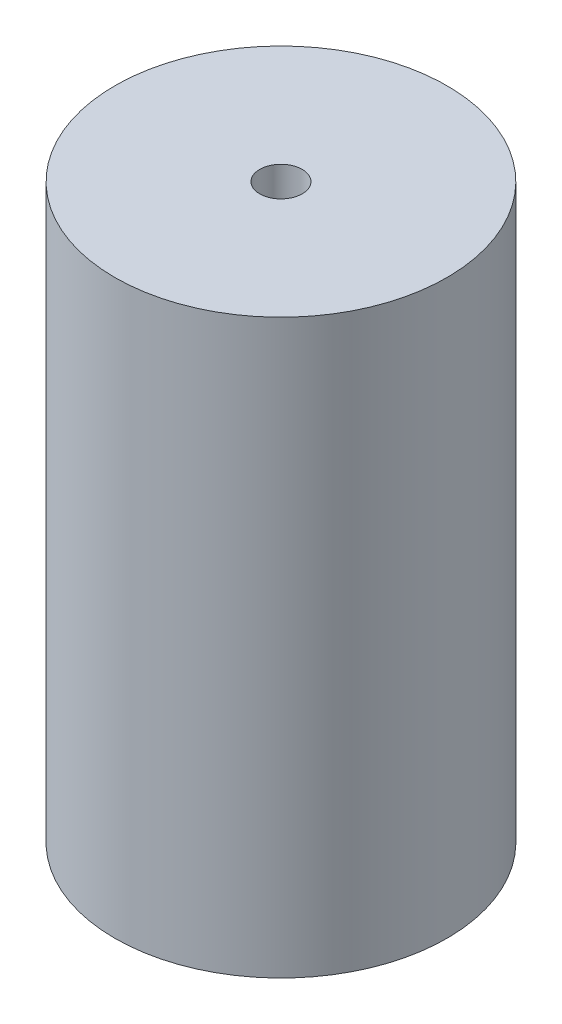
ISO-10303-21;
HEADER;
FILE_DESCRIPTION(('STEP AP214'),'2;1');
FILE_NAME('part.step','',(''),(''),'','','');
FILE_SCHEMA(('AUTOMOTIVE_DESIGN { 1 0 10303 214 1 1 1 1 }'));
ENDSEC;
DATA;
#1=APPLICATION_CONTEXT('core data for automotive mechanical design processes');
#2=APPLICATION_PROTOCOL_DEFINITION('international standard','automotive_design',2000,#1);
#3=PRODUCT_CONTEXT('',#1,'mechanical');
#4=PRODUCT('Part','Part','',(#3));
#5=PRODUCT_RELATED_PRODUCT_CATEGORY('part','',(#4));
#6=PRODUCT_DEFINITION_FORMATION('','',#4);
#7=PRODUCT_DEFINITION_CONTEXT('part definition',#1,'design');
#8=PRODUCT_DEFINITION('design','',#6,#7);
#9=PRODUCT_DEFINITION_SHAPE('','',#8);
#10=(LENGTH_UNIT() NAMED_UNIT(*) SI_UNIT(.MILLI.,.METRE.));
#11=(NAMED_UNIT(*) PLANE_ANGLE_UNIT() SI_UNIT($,.RADIAN.));
#12=(NAMED_UNIT(*) SI_UNIT($,.STERADIAN.) SOLID_ANGLE_UNIT());
#13=UNCERTAINTY_MEASURE_WITH_UNIT(LENGTH_MEASURE(1.E-05),#10,'distance_accuracy_value','');
#14=(GEOMETRIC_REPRESENTATION_CONTEXT(3) GLOBAL_UNCERTAINTY_ASSIGNED_CONTEXT((#13)) GLOBAL_UNIT_ASSIGNED_CONTEXT((#10,
#11,#12)) REPRESENTATION_CONTEXT('',''));
#15=CARTESIAN_POINT('',(0.,0.,0.));
#16=DIRECTION('',(0.,0.,1.));
#17=DIRECTION('',(1.,0.,0.));
#18=AXIS2_PLACEMENT_3D('',#15,#16,#17);
#19=CARTESIAN_POINT('',(0.,12.7,0.));
#20=DIRECTION('',(0.,1.,0.));
#21=DIRECTION('',(0.,0.,1.));
#22=AXIS2_PLACEMENT_3D('',#19,#20,#21);
#23=PLANE('',#22);
#24=CARTESIAN_POINT('',(0.,12.7,0.));
#25=DIRECTION('',(0.,1.,0.));
#26=DIRECTION('',(0.,0.,1.));
#27=AXIS2_PLACEMENT_3D('',#24,#25,#26);
#28=CIRCLE('',#27,8.9296875);
#29=CARTESIAN_POINT('',(0.,12.7,8.9296875));
#30=VERTEX_POINT('',#29);
#31=EDGE_CURVE('E70',#30,#30,#28,.T.);
#32=ORIENTED_EDGE('',*,*,#31,.F.);
#33=EDGE_LOOP('',(#32));
#34=FACE_BOUND('',#33,.T.);
#35=CARTESIAN_POINT('',(0.,12.7,0.));
#36=DIRECTION('',(0.,1.,0.));
#37=DIRECTION('',(0.,0.,1.));
#38=AXIS2_PLACEMENT_3D('',#35,#36,#37);
#39=CIRCLE('',#38,63.5);
#40=CARTESIAN_POINT('',(0.,12.7,63.5));
#41=VERTEX_POINT('',#40);
#42=EDGE_CURVE('E11',#41,#41,#39,.F.);
#43=ORIENTED_EDGE('',*,*,#42,.F.);
#44=EDGE_LOOP('',(#43));
#45=FACE_BOUND('',#44,.T.);
#46=ADVANCED_FACE('F41',(#34,#45),#23,.T.);
#47=CARTESIAN_POINT('',(0.,227.965,0.));
#48=DIRECTION('',(0.,-1.,0.));
#49=DIRECTION('',(0.,0.,-1.));
#50=AXIS2_PLACEMENT_3D('',#47,#48,#49);
#51=CYLINDRICAL_SURFACE('',#50,63.5);
#52=ORIENTED_EDGE('',*,*,#42,.T.);
#53=EDGE_LOOP('',(#52));
#54=FACE_BOUND('',#53,.T.);
#55=CARTESIAN_POINT('',(0.,227.965,0.));
#56=DIRECTION('',(0.,1.,0.));
#57=DIRECTION('',(0.,0.,1.));
#58=AXIS2_PLACEMENT_3D('',#55,#56,#57);
#59=CIRCLE('',#58,63.5);
#60=CARTESIAN_POINT('',(0.,227.965,63.5));
#61=VERTEX_POINT('',#60);
#62=EDGE_CURVE('E55',#61,#61,#59,.T.);
#63=ORIENTED_EDGE('',*,*,#62,.T.);
#64=EDGE_LOOP('',(#63));
#65=FACE_BOUND('',#64,.T.);
#66=ADVANCED_FACE('F92',(#54,#65),#51,.F.);
#67=CARTESIAN_POINT('',(0.,227.965,0.));
#68=DIRECTION('',(0.,1.,0.));
#69=DIRECTION('',(0.,0.,1.));
#70=AXIS2_PLACEMENT_3D('',#67,#68,#69);
#71=PLANE('',#70);
#72=CARTESIAN_POINT('',(0.,227.965,0.));
#73=DIRECTION('',(0.,1.,0.));
#74=DIRECTION('',(0.,0.,1.));
#75=AXIS2_PLACEMENT_3D('',#72,#73,#74);
#76=CIRCLE('',#75,8.9296875);
#77=CARTESIAN_POINT('',(0.,227.965,8.9296875));
#78=VERTEX_POINT('',#77);
#79=EDGE_CURVE('E45',#78,#78,#76,.T.);
#80=ORIENTED_EDGE('',*,*,#79,.T.);
#81=EDGE_LOOP('',(#80));
#82=FACE_BOUND('',#81,.T.);
#83=ORIENTED_EDGE('',*,*,#62,.F.);
#84=EDGE_LOOP('',(#83));
#85=FACE_BOUND('',#84,.T.);
#86=ADVANCED_FACE('F80',(#82,#85),#71,.F.);
#87=CARTESIAN_POINT('',(0.,-94.8690000000001,0.));
#88=DIRECTION('',(0.,1.,0.));
#89=DIRECTION('',(0.,0.,1.));
#90=AXIS2_PLACEMENT_3D('',#87,#88,#89);
#91=CYLINDRICAL_SURFACE('',#90,8.9296875);
#92=CARTESIAN_POINT('',(0.,240.665,0.));
#93=DIRECTION('',(0.,1.,0.));
#94=DIRECTION('',(0.,0.,1.));
#95=AXIS2_PLACEMENT_3D('',#92,#93,#94);
#96=CIRCLE('',#95,8.9296875);
#97=CARTESIAN_POINT('',(0.,240.665,8.9296875));
#98=VERTEX_POINT('',#97);
#99=EDGE_CURVE('E73',#98,#98,#96,.T.);
#100=ORIENTED_EDGE('',*,*,#99,.T.);
#101=EDGE_LOOP('',(#100));
#102=FACE_BOUND('',#101,.T.);
#103=ORIENTED_EDGE('',*,*,#79,.F.);
#104=EDGE_LOOP('',(#103));
#105=FACE_BOUND('',#104,.T.);
#106=ADVANCED_FACE('F83',(#102,#105),#91,.F.);
#107=ORIENTED_EDGE('',*,*,#31,.T.);
#108=EDGE_LOOP('',(#107));
#109=FACE_BOUND('',#108,.T.);
#110=CARTESIAN_POINT('',(0.,0.,0.));
#111=DIRECTION('',(0.,1.,0.));
#112=DIRECTION('',(0.,0.,1.));
#113=AXIS2_PLACEMENT_3D('',#110,#111,#112);
#114=CIRCLE('',#113,8.9296875);
#115=CARTESIAN_POINT('',(0.,0.,8.9296875));
#116=VERTEX_POINT('',#115);
#117=EDGE_CURVE('E66',#116,#116,#114,.T.);
#118=ORIENTED_EDGE('',*,*,#117,.F.);
#119=EDGE_LOOP('',(#118));
#120=FACE_BOUND('',#119,.T.);
#121=ADVANCED_FACE('F85',(#109,#120),#91,.F.);
#122=CARTESIAN_POINT('',(0.,12.7,0.));
#123=DIRECTION('',(0.,-1.,0.));
#124=DIRECTION('',(0.,0.,-1.));
#125=AXIS2_PLACEMENT_3D('',#122,#123,#124);
#126=CYLINDRICAL_SURFACE('',#125,69.85);
#127=CARTESIAN_POINT('',(0.,0.,0.));
#128=DIRECTION('',(0.,1.,0.));
#129=DIRECTION('',(0.,0.,1.));
#130=AXIS2_PLACEMENT_3D('',#127,#128,#129);
#131=CIRCLE('',#130,69.85);
#132=CARTESIAN_POINT('',(0.,0.,69.85));
#133=VERTEX_POINT('',#132);
#134=EDGE_CURVE('E49',#133,#133,#131,.T.);
#135=ORIENTED_EDGE('',*,*,#134,.T.);
#136=EDGE_LOOP('',(#135));
#137=FACE_BOUND('',#136,.T.);
#138=CARTESIAN_POINT('',(0.,240.665,0.));
#139=DIRECTION('',(0.,1.,0.));
#140=DIRECTION('',(0.,0.,1.));
#141=AXIS2_PLACEMENT_3D('',#138,#139,#140);
#142=CIRCLE('',#141,69.85);
#143=CARTESIAN_POINT('',(0.,240.665,69.85));
#144=VERTEX_POINT('',#143);
#145=EDGE_CURVE('E61',#144,#144,#142,.T.);
#146=ORIENTED_EDGE('',*,*,#145,.F.);
#147=EDGE_LOOP('',(#146));
#148=FACE_BOUND('',#147,.T.);
#149=ADVANCED_FACE('F43',(#137,#148),#126,.T.);
#150=CARTESIAN_POINT('',(0.,0.,0.));
#151=DIRECTION('',(0.,1.,0.));
#152=DIRECTION('',(0.,0.,1.));
#153=AXIS2_PLACEMENT_3D('',#150,#151,#152);
#154=PLANE('',#153);
#155=ORIENTED_EDGE('',*,*,#117,.T.);
#156=EDGE_LOOP('',(#155));
#157=FACE_BOUND('',#156,.T.);
#158=ORIENTED_EDGE('',*,*,#134,.F.);
#159=EDGE_LOOP('',(#158));
#160=FACE_BOUND('',#159,.T.);
#161=ADVANCED_FACE('F104',(#157,#160),#154,.F.);
#162=CARTESIAN_POINT('',(0.,240.665,0.));
#163=DIRECTION('',(0.,1.,0.));
#164=DIRECTION('',(0.,0.,1.));
#165=AXIS2_PLACEMENT_3D('',#162,#163,#164);
#166=PLANE('',#165);
#167=ORIENTED_EDGE('',*,*,#99,.F.);
#168=EDGE_LOOP('',(#167));
#169=FACE_BOUND('',#168,.T.);
#170=ORIENTED_EDGE('',*,*,#145,.T.);
#171=EDGE_LOOP('',(#170));
#172=FACE_BOUND('',#171,.T.);
#173=ADVANCED_FACE('F106',(#169,#172),#166,.T.);
#174=CLOSED_SHELL('',(#46,#66,#86,#106,#121,#149,#161,#173));
#175=MANIFOLD_SOLID_BREP('B2',#174);
#176=ADVANCED_BREP_SHAPE_REPRESENTATION('',(#18,#175),#14);
#177=SHAPE_DEFINITION_REPRESENTATION(#9,#176);
ENDSEC;
END-ISO-10303-21;
